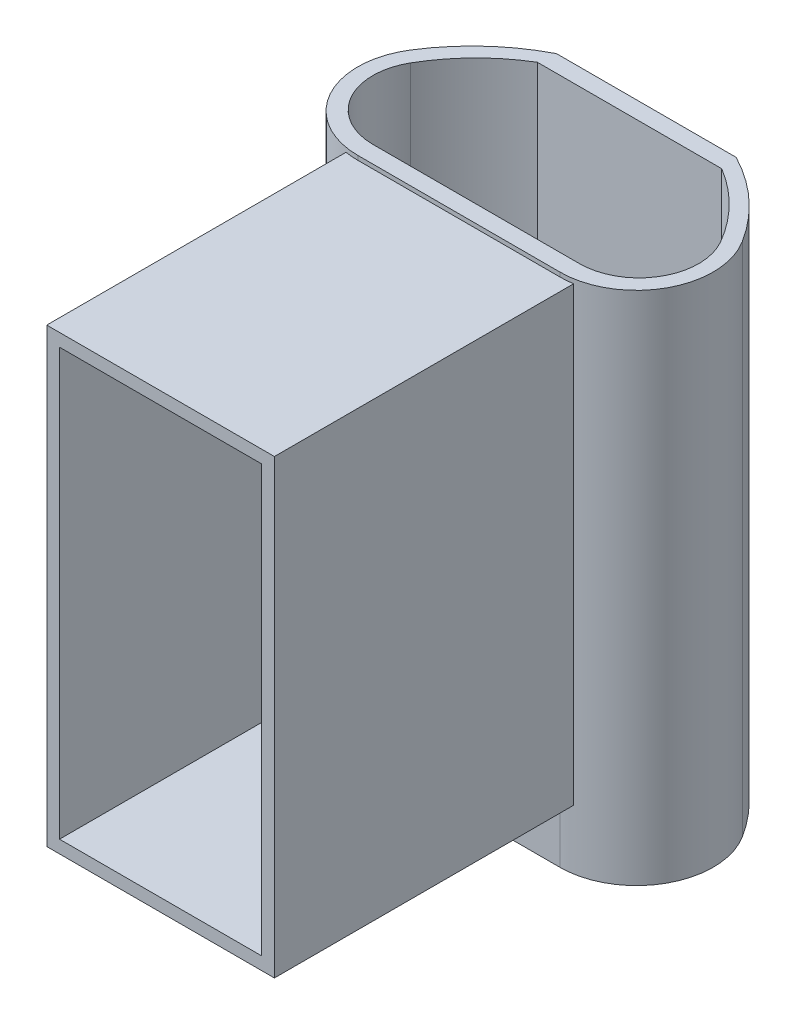
ISO-10303-21;
HEADER;
FILE_DESCRIPTION(('STEP AP214'),'2;1');
FILE_NAME('part.step','',(''),(''),'','','');
FILE_SCHEMA(('AUTOMOTIVE_DESIGN { 1 0 10303 214 1 1 1 1 }'));
ENDSEC;
DATA;
#1=APPLICATION_CONTEXT('core data for automotive mechanical design processes');
#2=APPLICATION_PROTOCOL_DEFINITION('international standard','automotive_design',2000,#1);
#3=PRODUCT_CONTEXT('',#1,'mechanical');
#4=PRODUCT('Part','Part','',(#3));
#5=PRODUCT_RELATED_PRODUCT_CATEGORY('part','',(#4));
#6=PRODUCT_DEFINITION_FORMATION('','',#4);
#7=PRODUCT_DEFINITION_CONTEXT('part definition',#1,'design');
#8=PRODUCT_DEFINITION('design','',#6,#7);
#9=PRODUCT_DEFINITION_SHAPE('','',#8);
#10=(LENGTH_UNIT() NAMED_UNIT(*) SI_UNIT(.MILLI.,.METRE.));
#11=(NAMED_UNIT(*) PLANE_ANGLE_UNIT() SI_UNIT($,.RADIAN.));
#12=(NAMED_UNIT(*) SI_UNIT($,.STERADIAN.) SOLID_ANGLE_UNIT());
#13=UNCERTAINTY_MEASURE_WITH_UNIT(LENGTH_MEASURE(1.E-05),#10,'distance_accuracy_value','');
#14=(GEOMETRIC_REPRESENTATION_CONTEXT(3) GLOBAL_UNCERTAINTY_ASSIGNED_CONTEXT((#13)) GLOBAL_UNIT_ASSIGNED_CONTEXT((#10,
#11,#12)) REPRESENTATION_CONTEXT('',''));
#15=CARTESIAN_POINT('',(0.,0.,0.));
#16=DIRECTION('',(0.,0.,1.));
#17=DIRECTION('',(1.,0.,0.));
#18=AXIS2_PLACEMENT_3D('',#15,#16,#17);
#19=CARTESIAN_POINT('',(0.,15.5,0.));
#20=DIRECTION('',(0.,1.,0.));
#21=DIRECTION('',(0.,0.,1.));
#22=AXIS2_PLACEMENT_3D('',#19,#20,#21);
#23=PLANE('',#22);
#24=CARTESIAN_POINT('',(-12.1243556529821,15.5,-7.));
#25=DIRECTION('',(0.,1.,0.));
#26=DIRECTION('',(0.,0.,1.));
#27=AXIS2_PLACEMENT_3D('',#24,#25,#26);
#28=CIRCLE('',#27,7.);
#29=CARTESIAN_POINT('',(-12.1243556529821,15.5,0.));
#30=VERTEX_POINT('',#29);
#31=CARTESIAN_POINT('',(-18.1865334794732,15.5,-10.5));
#32=VERTEX_POINT('',#31);
#33=EDGE_CURVE('E357',#30,#32,#28,.F.);
#34=ORIENTED_EDGE('',*,*,#33,.F.);
#35=DIRECTION('',(-1.,0.,0.));
#36=VECTOR('',#35,1.);
#37=CARTESIAN_POINT('',(0.,15.5,0.));
#38=LINE('',#37,#36);
#39=CARTESIAN_POINT('',(12.1243556529821,15.5,0.));
#40=VERTEX_POINT('',#39);
#41=EDGE_CURVE('E366',#40,#30,#38,.T.);
#42=ORIENTED_EDGE('',*,*,#41,.F.);
#43=CARTESIAN_POINT('',(12.1243556529821,15.5,-7.));
#44=DIRECTION('',(0.,1.,0.));
#45=DIRECTION('',(0.,0.,1.));
#46=AXIS2_PLACEMENT_3D('',#43,#44,#45);
#47=CIRCLE('',#46,7.);
#48=CARTESIAN_POINT('',(18.1865334794732,15.5,-10.5));
#49=VERTEX_POINT('',#48);
#50=EDGE_CURVE('E356',#49,#40,#47,.F.);
#51=ORIENTED_EDGE('',*,*,#50,.F.);
#52=CARTESIAN_POINT('',(0.,15.5,0.));
#53=DIRECTION('',(0.,1.,0.));
#54=DIRECTION('',(0.,0.,1.));
#55=AXIS2_PLACEMENT_3D('',#52,#53,#54);
#56=CIRCLE('',#55,21.);
#57=CARTESIAN_POINT('',(10.816653826392,15.5,-18.));
#58=VERTEX_POINT('',#57);
#59=EDGE_CURVE('E360',#58,#49,#56,.F.);
#60=ORIENTED_EDGE('',*,*,#59,.F.);
#61=DIRECTION('',(-1.,0.,0.));
#62=VECTOR('',#61,1.);
#63=CARTESIAN_POINT('',(0.,15.5,-18.));
#64=LINE('',#63,#62);
#65=CARTESIAN_POINT('',(-10.816653826392,15.5,-18.));
#66=VERTEX_POINT('',#65);
#67=EDGE_CURVE('E241',#58,#66,#64,.T.);
#68=ORIENTED_EDGE('',*,*,#67,.T.);
#69=CARTESIAN_POINT('',(0.,15.5,0.));
#70=DIRECTION('',(0.,1.,0.));
#71=DIRECTION('',(0.,0.,1.));
#72=AXIS2_PLACEMENT_3D('',#69,#70,#71);
#73=CIRCLE('',#72,21.);
#74=EDGE_CURVE('E363',#32,#66,#73,.F.);
#75=ORIENTED_EDGE('',*,*,#74,.F.);
#76=EDGE_LOOP('',(#34,#42,#51,#60,#68,#75));
#77=FACE_BOUND('',#76,.T.);
#78=CARTESIAN_POINT('',(11.8231616387094,15.5,-6.99999999999999));
#79=DIRECTION('',(0.,1.,0.));
#80=DIRECTION('',(0.,0.,1.));
#81=AXIS2_PLACEMENT_3D('',#78,#79,#80);
#82=CIRCLE('',#81,9.);
#83=CARTESIAN_POINT('',(19.445856551026,15.5,-11.784822073363));
#84=VERTEX_POINT('',#83);
#85=CARTESIAN_POINT('',(11.8231616387094,15.5,2.));
#86=VERTEX_POINT('',#85);
#87=EDGE_CURVE('E244',#84,#86,#82,.F.);
#88=ORIENTED_EDGE('',*,*,#87,.T.);
#89=DIRECTION('',(-1.,0.,0.));
#90=VECTOR('',#89,1.);
#91=CARTESIAN_POINT('',(22.9128784747792,15.5,2.));
#92=LINE('',#91,#90);
#93=CARTESIAN_POINT('',(-11.8918891996092,15.5,2.00000000000001));
#94=VERTEX_POINT('',#93);
#95=EDGE_CURVE('E232',#86,#94,#92,.T.);
#96=ORIENTED_EDGE('',*,*,#95,.T.);
#97=CARTESIAN_POINT('',(-11.8918891996092,15.5,-6.99999999999999));
#98=DIRECTION('',(0.,1.,0.));
#99=DIRECTION('',(0.,0.,1.));
#100=AXIS2_PLACEMENT_3D('',#97,#98,#99);
#101=CIRCLE('',#100,9.);
#102=CARTESIAN_POINT('',(-19.5145841119258,15.5,-11.784822073363));
#103=VERTEX_POINT('',#102);
#104=EDGE_CURVE('E59',#94,#103,#101,.F.);
#105=ORIENTED_EDGE('',*,*,#104,.T.);
#106=CARTESIAN_POINT('',(-0.0343637804498904,15.5,0.443056558564638));
#107=DIRECTION('',(0.,1.,0.));
#108=DIRECTION('',(0.,0.,1.));
#109=AXIS2_PLACEMENT_3D('',#106,#107,#108);
#110=CIRCLE('',#109,23.);
#111=CARTESIAN_POINT('',(-10.5738817268897,15.5,-20.));
#112=VERTEX_POINT('',#111);
#113=EDGE_CURVE('E225',#103,#112,#110,.F.);
#114=ORIENTED_EDGE('',*,*,#113,.T.);
#115=DIRECTION('',(1.,0.,0.));
#116=VECTOR('',#115,1.);
#117=CARTESIAN_POINT('',(0.,15.5,-20.));
#118=LINE('',#117,#116);
#119=CARTESIAN_POINT('',(10.50515416599,15.5,-20.));
#120=VERTEX_POINT('',#119);
#121=EDGE_CURVE('E210',#112,#120,#118,.T.);
#122=ORIENTED_EDGE('',*,*,#121,.T.);
#123=CARTESIAN_POINT('',(-0.0343637804498904,15.5,0.443056558564638));
#124=DIRECTION('',(0.,1.,0.));
#125=DIRECTION('',(0.,0.,1.));
#126=AXIS2_PLACEMENT_3D('',#123,#124,#125);
#127=CIRCLE('',#126,23.);
#128=EDGE_CURVE('E222',#120,#84,#127,.F.);
#129=ORIENTED_EDGE('',*,*,#128,.T.);
#130=EDGE_LOOP('',(#88,#96,#105,#114,#122,#129));
#131=FACE_BOUND('',#130,.T.);
#132=ADVANCED_FACE('F55',(#77,#131),#23,.F.);
#133=CARTESIAN_POINT('',(0.,76.,0.));
#134=DIRECTION('',(0.,-1.,0.));
#135=DIRECTION('',(0.,0.,-1.));
#136=AXIS2_PLACEMENT_3D('',#133,#134,#135);
#137=PLANE('',#136);
#138=DIRECTION('',(1.,0.,0.));
#139=VECTOR('',#138,1.);
#140=CARTESIAN_POINT('',(0.,76.,-18.));
#141=LINE('',#140,#139);
#142=CARTESIAN_POINT('',(-10.816653826392,76.,-18.));
#143=VERTEX_POINT('',#142);
#144=CARTESIAN_POINT('',(10.816653826392,76.,-18.));
#145=VERTEX_POINT('',#144);
#146=EDGE_CURVE('E236',#143,#145,#141,.T.);
#147=ORIENTED_EDGE('',*,*,#146,.T.);
#148=CARTESIAN_POINT('',(0.,76.,0.));
#149=DIRECTION('',(0.,-1.,0.));
#150=DIRECTION('',(0.,0.,-1.));
#151=AXIS2_PLACEMENT_3D('',#148,#149,#150);
#152=CIRCLE('',#151,21.);
#153=CARTESIAN_POINT('',(18.1865334794732,76.,-10.5));
#154=VERTEX_POINT('',#153);
#155=EDGE_CURVE('E361',#154,#145,#152,.F.);
#156=ORIENTED_EDGE('',*,*,#155,.F.);
#157=CARTESIAN_POINT('',(12.1243556529821,76.,-7.));
#158=DIRECTION('',(0.,-1.,0.));
#159=DIRECTION('',(0.,0.,-1.));
#160=AXIS2_PLACEMENT_3D('',#157,#158,#159);
#161=CIRCLE('',#160,7.);
#162=CARTESIAN_POINT('',(12.1243556529821,76.,0.));
#163=VERTEX_POINT('',#162);
#164=EDGE_CURVE('E354',#163,#154,#161,.F.);
#165=ORIENTED_EDGE('',*,*,#164,.F.);
#166=DIRECTION('',(1.,0.,0.));
#167=VECTOR('',#166,1.);
#168=CARTESIAN_POINT('',(0.,76.,0.));
#169=LINE('',#168,#167);
#170=CARTESIAN_POINT('',(-12.1243556529821,76.,0.));
#171=VERTEX_POINT('',#170);
#172=EDGE_CURVE('E367',#171,#163,#169,.T.);
#173=ORIENTED_EDGE('',*,*,#172,.F.);
#174=CARTESIAN_POINT('',(-12.1243556529821,76.,-7.));
#175=DIRECTION('',(0.,-1.,0.));
#176=DIRECTION('',(0.,0.,-1.));
#177=AXIS2_PLACEMENT_3D('',#174,#175,#176);
#178=CIRCLE('',#177,7.);
#179=CARTESIAN_POINT('',(-18.1865334794732,76.,-10.5));
#180=VERTEX_POINT('',#179);
#181=EDGE_CURVE('E358',#180,#171,#178,.F.);
#182=ORIENTED_EDGE('',*,*,#181,.F.);
#183=CARTESIAN_POINT('',(0.,76.,0.));
#184=DIRECTION('',(0.,-1.,0.));
#185=DIRECTION('',(0.,0.,-1.));
#186=AXIS2_PLACEMENT_3D('',#183,#184,#185);
#187=CIRCLE('',#186,21.);
#188=EDGE_CURVE('E364',#143,#180,#187,.F.);
#189=ORIENTED_EDGE('',*,*,#188,.F.);
#190=EDGE_LOOP('',(#147,#156,#165,#173,#182,#189));
#191=FACE_BOUND('',#190,.T.);
#192=CARTESIAN_POINT('',(-0.0343637804498904,76.,0.443056558564638));
#193=DIRECTION('',(0.,-1.,0.));
#194=DIRECTION('',(0.,0.,-1.));
#195=AXIS2_PLACEMENT_3D('',#192,#193,#194);
#196=CIRCLE('',#195,23.);
#197=CARTESIAN_POINT('',(19.445856551026,76.,-11.784822073363));
#198=VERTEX_POINT('',#197);
#199=CARTESIAN_POINT('',(10.50515416599,76.,-20.));
#200=VERTEX_POINT('',#199);
#201=EDGE_CURVE('E231',#198,#200,#196,.F.);
#202=ORIENTED_EDGE('',*,*,#201,.T.);
#203=DIRECTION('',(-1.,0.,0.));
#204=VECTOR('',#203,1.);
#205=CARTESIAN_POINT('',(-10.5738817268897,76.,-20.));
#206=LINE('',#205,#204);
#207=CARTESIAN_POINT('',(-10.5738817268897,76.,-20.));
#208=VERTEX_POINT('',#207);
#209=EDGE_CURVE('E212',#200,#208,#206,.T.);
#210=ORIENTED_EDGE('',*,*,#209,.T.);
#211=CARTESIAN_POINT('',(-0.0343637804498904,76.,0.443056558564638));
#212=DIRECTION('',(0.,-1.,0.));
#213=DIRECTION('',(0.,0.,-1.));
#214=AXIS2_PLACEMENT_3D('',#211,#212,#213);
#215=CIRCLE('',#214,23.);
#216=CARTESIAN_POINT('',(-19.5145841119258,76.,-11.784822073363));
#217=VERTEX_POINT('',#216);
#218=EDGE_CURVE('E372',#208,#217,#215,.F.);
#219=ORIENTED_EDGE('',*,*,#218,.T.);
#220=CARTESIAN_POINT('',(-11.8918891996092,76.,-6.99999999999999));
#221=DIRECTION('',(0.,-1.,0.));
#222=DIRECTION('',(0.,0.,-1.));
#223=AXIS2_PLACEMENT_3D('',#220,#221,#222);
#224=CIRCLE('',#223,9.);
#225=CARTESIAN_POINT('',(-11.8918891996092,76.,2.00000000000001));
#226=VERTEX_POINT('',#225);
#227=EDGE_CURVE('E245',#217,#226,#224,.F.);
#228=ORIENTED_EDGE('',*,*,#227,.T.);
#229=DIRECTION('',(1.,0.,0.));
#230=VECTOR('',#229,1.);
#231=CARTESIAN_POINT('',(22.9128784747792,76.,2.));
#232=LINE('',#231,#230);
#233=CARTESIAN_POINT('',(11.8231616387094,76.,2.));
#234=VERTEX_POINT('',#233);
#235=EDGE_CURVE('E369',#226,#234,#232,.T.);
#236=ORIENTED_EDGE('',*,*,#235,.T.);
#237=CARTESIAN_POINT('',(11.8231616387094,76.,-6.99999999999999));
#238=DIRECTION('',(0.,-1.,0.));
#239=DIRECTION('',(0.,0.,-1.));
#240=AXIS2_PLACEMENT_3D('',#237,#238,#239);
#241=CIRCLE('',#240,9.);
#242=EDGE_CURVE('E243',#234,#198,#241,.F.);
#243=ORIENTED_EDGE('',*,*,#242,.T.);
#244=EDGE_LOOP('',(#202,#210,#219,#228,#236,#243));
#245=FACE_BOUND('',#244,.T.);
#246=ADVANCED_FACE('F57',(#191,#245),#137,.F.);
#247=CARTESIAN_POINT('',(0.,0.,37.));
#248=DIRECTION('',(0.,0.,-1.));
#249=DIRECTION('',(-1.,0.,0.));
#250=AXIS2_PLACEMENT_3D('',#247,#248,#249);
#251=PLANE('',#250);
#252=DIRECTION('',(-1.,0.,0.));
#253=VECTOR('',#252,1.);
#254=CARTESIAN_POINT('',(-13.3918891996092,75.5,37.));
#255=LINE('',#254,#253);
#256=CARTESIAN_POINT('',(13.3231616387094,75.5,37.));
#257=VERTEX_POINT('',#256);
#258=CARTESIAN_POINT('',(-13.3918891996092,75.5,37.));
#259=VERTEX_POINT('',#258);
#260=EDGE_CURVE('E345',#257,#259,#255,.T.);
#261=ORIENTED_EDGE('',*,*,#260,.T.);
#262=DIRECTION('',(0.,-1.,0.));
#263=VECTOR('',#262,1.);
#264=CARTESIAN_POINT('',(-13.3918891996092,75.5,37.));
#265=LINE('',#264,#263);
#266=CARTESIAN_POINT('',(-13.3918891996092,22.5,37.));
#267=VERTEX_POINT('',#266);
#268=EDGE_CURVE('E342',#259,#267,#265,.T.);
#269=ORIENTED_EDGE('',*,*,#268,.T.);
#270=DIRECTION('',(1.,0.,0.));
#271=VECTOR('',#270,1.);
#272=CARTESIAN_POINT('',(-13.3918891996092,22.5,37.));
#273=LINE('',#272,#271);
#274=CARTESIAN_POINT('',(13.3231616387094,22.5,37.));
#275=VERTEX_POINT('',#274);
#276=EDGE_CURVE('E339',#267,#275,#273,.T.);
#277=ORIENTED_EDGE('',*,*,#276,.T.);
#278=DIRECTION('',(0.,1.,0.));
#279=VECTOR('',#278,1.);
#280=CARTESIAN_POINT('',(13.3231616387094,75.5,37.));
#281=LINE('',#280,#279);
#282=EDGE_CURVE('E331',#275,#257,#281,.T.);
#283=ORIENTED_EDGE('',*,*,#282,.T.);
#284=EDGE_LOOP('',(#261,#269,#277,#283));
#285=FACE_BOUND('',#284,.T.);
#286=DIRECTION('',(0.,-1.,0.));
#287=VECTOR('',#286,1.);
#288=CARTESIAN_POINT('',(-11.8918891996092,74.,37.));
#289=LINE('',#288,#287);
#290=CARTESIAN_POINT('',(-11.8918891996092,74.,37.));
#291=VERTEX_POINT('',#290);
#292=CARTESIAN_POINT('',(-11.8918891996092,24.,37.));
#293=VERTEX_POINT('',#292);
#294=EDGE_CURVE('E13',#291,#293,#289,.T.);
#295=ORIENTED_EDGE('',*,*,#294,.F.);
#296=DIRECTION('',(-1.,0.,0.));
#297=VECTOR('',#296,1.);
#298=CARTESIAN_POINT('',(-11.8918891996092,74.,37.));
#299=LINE('',#298,#297);
#300=CARTESIAN_POINT('',(11.8231616387094,74.,37.));
#301=VERTEX_POINT('',#300);
#302=EDGE_CURVE('E348',#301,#291,#299,.T.);
#303=ORIENTED_EDGE('',*,*,#302,.F.);
#304=DIRECTION('',(0.,1.,0.));
#305=VECTOR('',#304,1.);
#306=CARTESIAN_POINT('',(11.8231616387094,74.,37.));
#307=LINE('',#306,#305);
#308=CARTESIAN_POINT('',(11.8231616387094,24.,37.));
#309=VERTEX_POINT('',#308);
#310=EDGE_CURVE('E351',#309,#301,#307,.T.);
#311=ORIENTED_EDGE('',*,*,#310,.F.);
#312=DIRECTION('',(1.,0.,0.));
#313=VECTOR('',#312,1.);
#314=CARTESIAN_POINT('',(-11.8918891996092,24.,37.));
#315=LINE('',#314,#313);
#316=EDGE_CURVE('E64',#293,#309,#315,.T.);
#317=ORIENTED_EDGE('',*,*,#316,.F.);
#318=EDGE_LOOP('',(#295,#303,#311,#317));
#319=FACE_BOUND('',#318,.T.);
#320=ADVANCED_FACE('F423',(#285,#319),#251,.F.);
#321=CARTESIAN_POINT('',(-10.5738817268897,14.,-20.));
#322=DIRECTION('',(0.,0.,-1.));
#323=DIRECTION('',(-1.,0.,0.));
#324=AXIS2_PLACEMENT_3D('',#321,#322,#323);
#325=PLANE('',#324);
#326=ORIENTED_EDGE('',*,*,#209,.F.);
#327=DIRECTION('',(0.,1.,0.));
#328=VECTOR('',#327,1.);
#329=CARTESIAN_POINT('',(10.50515416599,14.,-20.));
#330=LINE('',#329,#328);
#331=EDGE_CURVE('E206',#120,#200,#330,.T.);
#332=ORIENTED_EDGE('',*,*,#331,.F.);
#333=ORIENTED_EDGE('',*,*,#121,.F.);
#334=DIRECTION('',(0.,1.,0.));
#335=VECTOR('',#334,1.);
#336=CARTESIAN_POINT('',(-10.5738817268897,14.,-20.));
#337=LINE('',#336,#335);
#338=EDGE_CURVE('E218',#112,#208,#337,.T.);
#339=ORIENTED_EDGE('',*,*,#338,.T.);
#340=EDGE_LOOP('',(#326,#332,#333,#339));
#341=FACE_BOUND('',#340,.T.);
#342=ADVANCED_FACE('F208',(#341),#325,.T.);
#343=CARTESIAN_POINT('',(13.3231616387094,75.5,1.00000000000001));
#344=DIRECTION('',(1.,0.,0.));
#345=DIRECTION('',(0.,0.,-1.));
#346=AXIS2_PLACEMENT_3D('',#343,#344,#345);
#347=PLANE('',#346);
#348=DIRECTION('',(0.,0.,1.));
#349=VECTOR('',#348,1.);
#350=CARTESIAN_POINT('',(13.3231616387094,22.5,1.00000000000001));
#351=LINE('',#350,#349);
#352=CARTESIAN_POINT('',(13.3231616387094,22.5,1.87411967464943));
#353=VERTEX_POINT('',#352);
#354=EDGE_CURVE('E334',#353,#275,#351,.T.);
#355=ORIENTED_EDGE('',*,*,#354,.F.);
#356=DIRECTION('',(0.,1.,0.));
#357=VECTOR('',#356,1.);
#358=CARTESIAN_POINT('',(13.3231616387094,14.,1.87411967464943));
#359=LINE('',#358,#357);
#360=CARTESIAN_POINT('',(13.3231616387094,75.5,1.87411967464943));
#361=VERTEX_POINT('',#360);
#362=EDGE_CURVE('E410',#353,#361,#359,.T.);
#363=ORIENTED_EDGE('',*,*,#362,.T.);
#364=DIRECTION('',(0.,0.,1.));
#365=VECTOR('',#364,1.);
#366=CARTESIAN_POINT('',(13.3231616387094,75.5,1.00000000000001));
#367=LINE('',#366,#365);
#368=EDGE_CURVE('E328',#361,#257,#367,.T.);
#369=ORIENTED_EDGE('',*,*,#368,.T.);
#370=ORIENTED_EDGE('',*,*,#282,.F.);
#371=EDGE_LOOP('',(#355,#363,#369,#370));
#372=FACE_BOUND('',#371,.T.);
#373=ADVANCED_FACE('F428',(#372),#347,.T.);
#374=CARTESIAN_POINT('',(22.9128784747792,14.,2.));
#375=DIRECTION('',(0.,0.,1.));
#376=DIRECTION('',(1.,0.,0.));
#377=AXIS2_PLACEMENT_3D('',#374,#375,#376);
#378=PLANE('',#377);
#379=ORIENTED_EDGE('',*,*,#235,.F.);
#380=DIRECTION('',(0.,1.,0.));
#381=VECTOR('',#380,1.);
#382=CARTESIAN_POINT('',(-11.8918891996092,14.,2.00000000000001));
#383=LINE('',#382,#381);
#384=CARTESIAN_POINT('',(-11.8918891996092,75.5,2.00000000000001));
#385=VERTEX_POINT('',#384);
#386=EDGE_CURVE('E278',#226,#385,#383,.F.);
#387=ORIENTED_EDGE('',*,*,#386,.T.);
#388=DIRECTION('',(-1.,0.,0.));
#389=VECTOR('',#388,1.);
#390=CARTESIAN_POINT('',(22.9128784747792,75.5,2.));
#391=LINE('',#390,#389);
#392=CARTESIAN_POINT('',(11.8231616387094,75.5,2.));
#393=VERTEX_POINT('',#392);
#394=EDGE_CURVE('E319',#393,#385,#391,.T.);
#395=ORIENTED_EDGE('',*,*,#394,.F.);
#396=DIRECTION('',(0.,1.,0.));
#397=VECTOR('',#396,1.);
#398=CARTESIAN_POINT('',(11.8231616387094,14.,2.));
#399=LINE('',#398,#397);
#400=EDGE_CURVE('E279',#393,#234,#399,.T.);
#401=ORIENTED_EDGE('',*,*,#400,.T.);
#402=EDGE_LOOP('',(#379,#387,#395,#401));
#403=FACE_BOUND('',#402,.T.);
#404=ADVANCED_FACE('F441',(#403),#378,.T.);
#405=CARTESIAN_POINT('',(-13.3918891996092,75.5,1.00000000000001));
#406=DIRECTION('',(0.,1.,0.));
#407=DIRECTION('',(0.,0.,1.));
#408=AXIS2_PLACEMENT_3D('',#405,#406,#407);
#409=PLANE('',#408);
#410=ORIENTED_EDGE('',*,*,#368,.F.);
#411=CARTESIAN_POINT('',(11.8231616387094,75.5,-6.99999999999999));
#412=DIRECTION('',(0.,1.,0.));
#413=DIRECTION('',(0.,0.,1.));
#414=AXIS2_PLACEMENT_3D('',#411,#412,#413);
#415=CIRCLE('',#414,9.);
#416=EDGE_CURVE('E312',#361,#393,#415,.F.);
#417=ORIENTED_EDGE('',*,*,#416,.T.);
#418=ORIENTED_EDGE('',*,*,#394,.T.);
#419=CARTESIAN_POINT('',(-11.8918891996092,75.5,-6.99999999999999));
#420=DIRECTION('',(0.,1.,0.));
#421=DIRECTION('',(0.,0.,1.));
#422=AXIS2_PLACEMENT_3D('',#419,#420,#421);
#423=CIRCLE('',#422,9.);
#424=CARTESIAN_POINT('',(-13.3918891996092,75.5,1.87411967464943));
#425=VERTEX_POINT('',#424);
#426=EDGE_CURVE('E295',#385,#425,#423,.F.);
#427=ORIENTED_EDGE('',*,*,#426,.T.);
#428=DIRECTION('',(0.,0.,1.));
#429=VECTOR('',#428,1.);
#430=CARTESIAN_POINT('',(-13.3918891996092,75.5,1.00000000000001));
#431=LINE('',#430,#429);
#432=EDGE_CURVE('E329',#425,#259,#431,.T.);
#433=ORIENTED_EDGE('',*,*,#432,.T.);
#434=ORIENTED_EDGE('',*,*,#260,.F.);
#435=EDGE_LOOP('',(#410,#417,#418,#427,#433,#434));
#436=FACE_BOUND('',#435,.T.);
#437=ADVANCED_FACE('F416',(#436),#409,.T.);
#438=CARTESIAN_POINT('',(-13.3918891996092,75.5,1.00000000000001));
#439=DIRECTION('',(-1.,0.,0.));
#440=DIRECTION('',(0.,0.,1.));
#441=AXIS2_PLACEMENT_3D('',#438,#439,#440);
#442=PLANE('',#441);
#443=ORIENTED_EDGE('',*,*,#432,.F.);
#444=DIRECTION('',(0.,1.,0.));
#445=VECTOR('',#444,1.);
#446=CARTESIAN_POINT('',(-13.3918891996092,14.,1.87411967464943));
#447=LINE('',#446,#445);
#448=CARTESIAN_POINT('',(-13.3918891996092,22.5,1.87411967464943));
#449=VERTEX_POINT('',#448);
#450=EDGE_CURVE('E285',#425,#449,#447,.F.);
#451=ORIENTED_EDGE('',*,*,#450,.T.);
#452=DIRECTION('',(0.,0.,1.));
#453=VECTOR('',#452,1.);
#454=CARTESIAN_POINT('',(-13.3918891996092,22.5,1.00000000000001));
#455=LINE('',#454,#453);
#456=EDGE_CURVE('E332',#449,#267,#455,.T.);
#457=ORIENTED_EDGE('',*,*,#456,.T.);
#458=ORIENTED_EDGE('',*,*,#268,.F.);
#459=EDGE_LOOP('',(#443,#451,#457,#458));
#460=FACE_BOUND('',#459,.T.);
#461=ADVANCED_FACE('F420',(#460),#442,.T.);
#462=CARTESIAN_POINT('',(-13.3918891996092,22.5,1.00000000000001));
#463=DIRECTION('',(0.,-1.,0.));
#464=DIRECTION('',(0.,0.,-1.));
#465=AXIS2_PLACEMENT_3D('',#462,#463,#464);
#466=PLANE('',#465);
#467=DIRECTION('',(1.,0.,0.));
#468=VECTOR('',#467,1.);
#469=CARTESIAN_POINT('',(22.9128784747792,22.5,2.));
#470=LINE('',#469,#468);
#471=CARTESIAN_POINT('',(-11.8918891996092,22.5,2.00000000000001));
#472=VERTEX_POINT('',#471);
#473=CARTESIAN_POINT('',(11.8231616387094,22.5,2.));
#474=VERTEX_POINT('',#473);
#475=EDGE_CURVE('E325',#472,#474,#470,.T.);
#476=ORIENTED_EDGE('',*,*,#475,.T.);
#477=CARTESIAN_POINT('',(11.8231616387094,22.5,-6.99999999999999));
#478=DIRECTION('',(0.,-1.,0.));
#479=DIRECTION('',(0.,0.,-1.));
#480=AXIS2_PLACEMENT_3D('',#477,#478,#479);
#481=CIRCLE('',#480,9.);
#482=EDGE_CURVE('E322',#474,#353,#481,.F.);
#483=ORIENTED_EDGE('',*,*,#482,.T.);
#484=ORIENTED_EDGE('',*,*,#354,.T.);
#485=ORIENTED_EDGE('',*,*,#276,.F.);
#486=ORIENTED_EDGE('',*,*,#456,.F.);
#487=CARTESIAN_POINT('',(-11.8918891996092,22.5,-6.99999999999999));
#488=DIRECTION('',(0.,-1.,0.));
#489=DIRECTION('',(0.,0.,-1.));
#490=AXIS2_PLACEMENT_3D('',#487,#488,#489);
#491=CIRCLE('',#490,9.);
#492=EDGE_CURVE('E289',#449,#472,#491,.F.);
#493=ORIENTED_EDGE('',*,*,#492,.T.);
#494=EDGE_LOOP('',(#476,#483,#484,#485,#486,#493));
#495=FACE_BOUND('',#494,.T.);
#496=ADVANCED_FACE('F435',(#495),#466,.T.);
#497=ORIENTED_EDGE('',*,*,#95,.F.);
#498=EDGE_CURVE('E282',#86,#474,#399,.T.);
#499=ORIENTED_EDGE('',*,*,#498,.T.);
#500=ORIENTED_EDGE('',*,*,#475,.F.);
#501=EDGE_CURVE('E275',#472,#94,#383,.F.);
#502=ORIENTED_EDGE('',*,*,#501,.T.);
#503=EDGE_LOOP('',(#497,#499,#500,#502));
#504=FACE_BOUND('',#503,.T.);
#505=ADVANCED_FACE('F438',(#504),#378,.T.);
#506=CARTESIAN_POINT('',(-0.0343637804498904,14.,0.443056558564638));
#507=DIRECTION('',(0.,1.,0.));
#508=DIRECTION('',(0.,0.,1.));
#509=AXIS2_PLACEMENT_3D('',#506,#507,#508);
#510=CYLINDRICAL_SURFACE('',#509,23.);
#511=DIRECTION('',(0.,1.,0.));
#512=VECTOR('',#511,1.);
#513=CARTESIAN_POINT('',(19.445856551026,14.,-11.784822073363));
#514=LINE('',#513,#512);
#515=EDGE_CURVE('E230',#198,#84,#514,.F.);
#516=ORIENTED_EDGE('',*,*,#515,.T.);
#517=ORIENTED_EDGE('',*,*,#128,.F.);
#518=ORIENTED_EDGE('',*,*,#331,.T.);
#519=ORIENTED_EDGE('',*,*,#201,.F.);
#520=EDGE_LOOP('',(#516,#517,#518,#519));
#521=FACE_BOUND('',#520,.T.);
#522=ADVANCED_FACE('F228',(#521),#510,.T.);
#523=CARTESIAN_POINT('',(-0.0343637804498904,14.,0.443056558564638));
#524=DIRECTION('',(0.,1.,0.));
#525=DIRECTION('',(0.,0.,1.));
#526=AXIS2_PLACEMENT_3D('',#523,#524,#525);
#527=CYLINDRICAL_SURFACE('',#526,23.);
#528=ORIENTED_EDGE('',*,*,#338,.F.);
#529=ORIENTED_EDGE('',*,*,#113,.F.);
#530=DIRECTION('',(0.,1.,0.));
#531=VECTOR('',#530,1.);
#532=CARTESIAN_POINT('',(-19.5145841119258,14.,-11.784822073363));
#533=LINE('',#532,#531);
#534=EDGE_CURVE('E283',#103,#217,#533,.T.);
#535=ORIENTED_EDGE('',*,*,#534,.T.);
#536=ORIENTED_EDGE('',*,*,#218,.F.);
#537=EDGE_LOOP('',(#528,#529,#535,#536));
#538=FACE_BOUND('',#537,.T.);
#539=ADVANCED_FACE('F442',(#538),#527,.T.);
#540=CARTESIAN_POINT('',(-11.8918891996092,14.,-6.99999999999999));
#541=DIRECTION('',(0.,1.,0.));
#542=DIRECTION('',(0.,0.,1.));
#543=AXIS2_PLACEMENT_3D('',#540,#541,#542);
#544=CYLINDRICAL_SURFACE('',#543,9.);
#545=ORIENTED_EDGE('',*,*,#534,.F.);
#546=ORIENTED_EDGE('',*,*,#104,.F.);
#547=ORIENTED_EDGE('',*,*,#501,.F.);
#548=ORIENTED_EDGE('',*,*,#492,.F.);
#549=ORIENTED_EDGE('',*,*,#450,.F.);
#550=ORIENTED_EDGE('',*,*,#426,.F.);
#551=ORIENTED_EDGE('',*,*,#386,.F.);
#552=ORIENTED_EDGE('',*,*,#227,.F.);
#553=EDGE_LOOP('',(#545,#546,#547,#548,#549,#550,#551,#552));
#554=FACE_BOUND('',#553,.T.);
#555=ADVANCED_FACE('F439',(#554),#544,.T.);
#556=CARTESIAN_POINT('',(11.8231616387094,14.,-6.99999999999999));
#557=DIRECTION('',(0.,1.,0.));
#558=DIRECTION('',(0.,0.,1.));
#559=AXIS2_PLACEMENT_3D('',#556,#557,#558);
#560=CYLINDRICAL_SURFACE('',#559,9.);
#561=ORIENTED_EDGE('',*,*,#498,.F.);
#562=ORIENTED_EDGE('',*,*,#87,.F.);
#563=ORIENTED_EDGE('',*,*,#515,.F.);
#564=ORIENTED_EDGE('',*,*,#242,.F.);
#565=ORIENTED_EDGE('',*,*,#400,.F.);
#566=ORIENTED_EDGE('',*,*,#416,.F.);
#567=ORIENTED_EDGE('',*,*,#362,.F.);
#568=ORIENTED_EDGE('',*,*,#482,.F.);
#569=EDGE_LOOP('',(#561,#562,#563,#564,#565,#566,#567,#568));
#570=FACE_BOUND('',#569,.T.);
#571=ADVANCED_FACE('F432',(#570),#560,.T.);
#572=CARTESIAN_POINT('',(11.8231616387094,74.,-5.99999999999999));
#573=DIRECTION('',(1.,0.,0.));
#574=DIRECTION('',(0.,1.,0.));
#575=AXIS2_PLACEMENT_3D('',#572,#573,#574);
#576=PLANE('',#575);
#577=DIRECTION('',(0.,0.,1.));
#578=VECTOR('',#577,1.);
#579=CARTESIAN_POINT('',(11.8231616387094,24.,-5.99999999999999));
#580=LINE('',#579,#578);
#581=CARTESIAN_POINT('',(11.8231616387094,24.,0.));
#582=VERTEX_POINT('',#581);
#583=EDGE_CURVE('E79',#582,#309,#580,.T.);
#584=ORIENTED_EDGE('',*,*,#583,.T.);
#585=ORIENTED_EDGE('',*,*,#310,.T.);
#586=DIRECTION('',(0.,0.,1.));
#587=VECTOR('',#586,1.);
#588=CARTESIAN_POINT('',(11.8231616387094,74.,-5.99999999999999));
#589=LINE('',#588,#587);
#590=CARTESIAN_POINT('',(11.8231616387094,74.,0.));
#591=VERTEX_POINT('',#590);
#592=EDGE_CURVE('E314',#591,#301,#589,.T.);
#593=ORIENTED_EDGE('',*,*,#592,.F.);
#594=DIRECTION('',(0.,1.,0.));
#595=VECTOR('',#594,1.);
#596=CARTESIAN_POINT('',(11.8231616387094,81.5,0.));
#597=LINE('',#596,#595);
#598=EDGE_CURVE('E217',#582,#591,#597,.T.);
#599=ORIENTED_EDGE('',*,*,#598,.F.);
#600=EDGE_LOOP('',(#584,#585,#593,#599));
#601=FACE_BOUND('',#600,.T.);
#602=ADVANCED_FACE('F459',(#601),#576,.F.);
#603=CARTESIAN_POINT('',(-11.8918891996092,24.,-5.99999999999999));
#604=DIRECTION('',(0.,-1.,0.));
#605=DIRECTION('',(0.,0.,-1.));
#606=AXIS2_PLACEMENT_3D('',#603,#604,#605);
#607=PLANE('',#606);
#608=DIRECTION('',(0.,0.,1.));
#609=VECTOR('',#608,1.);
#610=CARTESIAN_POINT('',(-11.8918891996092,24.,-5.99999999999999));
#611=LINE('',#610,#609);
#612=CARTESIAN_POINT('',(-11.8918891996092,24.,0.));
#613=VERTEX_POINT('',#612);
#614=EDGE_CURVE('E72',#613,#293,#611,.T.);
#615=ORIENTED_EDGE('',*,*,#614,.T.);
#616=ORIENTED_EDGE('',*,*,#316,.T.);
#617=ORIENTED_EDGE('',*,*,#583,.F.);
#618=DIRECTION('',(1.,0.,0.));
#619=VECTOR('',#618,1.);
#620=CARTESIAN_POINT('',(0.,24.,0.));
#621=LINE('',#620,#619);
#622=EDGE_CURVE('E307',#613,#582,#621,.T.);
#623=ORIENTED_EDGE('',*,*,#622,.F.);
#624=EDGE_LOOP('',(#615,#616,#617,#623));
#625=FACE_BOUND('',#624,.T.);
#626=ADVANCED_FACE('F463',(#625),#607,.F.);
#627=CARTESIAN_POINT('',(-11.8918891996092,74.,-5.99999999999999));
#628=DIRECTION('',(-1.,0.,0.));
#629=DIRECTION('',(0.,0.,1.));
#630=AXIS2_PLACEMENT_3D('',#627,#628,#629);
#631=PLANE('',#630);
#632=DIRECTION('',(0.,0.,1.));
#633=VECTOR('',#632,1.);
#634=CARTESIAN_POINT('',(-11.8918891996092,74.,-5.99999999999999));
#635=LINE('',#634,#633);
#636=CARTESIAN_POINT('',(-11.8918891996092,74.,0.));
#637=VERTEX_POINT('',#636);
#638=EDGE_CURVE('E310',#637,#291,#635,.T.);
#639=ORIENTED_EDGE('',*,*,#638,.T.);
#640=ORIENTED_EDGE('',*,*,#294,.T.);
#641=ORIENTED_EDGE('',*,*,#614,.F.);
#642=DIRECTION('',(0.,-1.,0.));
#643=VECTOR('',#642,1.);
#644=CARTESIAN_POINT('',(-11.8918891996092,81.5,0.));
#645=LINE('',#644,#643);
#646=EDGE_CURVE('E301',#637,#613,#645,.T.);
#647=ORIENTED_EDGE('',*,*,#646,.F.);
#648=EDGE_LOOP('',(#639,#640,#641,#647));
#649=FACE_BOUND('',#648,.T.);
#650=ADVANCED_FACE('F469',(#649),#631,.F.);
#651=CARTESIAN_POINT('',(-11.8918891996092,74.,-5.99999999999999));
#652=DIRECTION('',(0.,1.,0.));
#653=DIRECTION('',(0.,0.,1.));
#654=AXIS2_PLACEMENT_3D('',#651,#652,#653);
#655=PLANE('',#654);
#656=ORIENTED_EDGE('',*,*,#592,.T.);
#657=ORIENTED_EDGE('',*,*,#302,.T.);
#658=ORIENTED_EDGE('',*,*,#638,.F.);
#659=DIRECTION('',(-1.,0.,0.));
#660=VECTOR('',#659,1.);
#661=CARTESIAN_POINT('',(0.,74.,0.));
#662=LINE('',#661,#660);
#663=EDGE_CURVE('E304',#591,#637,#662,.T.);
#664=ORIENTED_EDGE('',*,*,#663,.F.);
#665=EDGE_LOOP('',(#656,#657,#658,#664));
#666=FACE_BOUND('',#665,.T.);
#667=ADVANCED_FACE('F473',(#666),#655,.F.);
#668=CARTESIAN_POINT('',(0.,81.5,-18.));
#669=DIRECTION('',(0.,0.,1.));
#670=DIRECTION('',(1.,0.,0.));
#671=AXIS2_PLACEMENT_3D('',#668,#669,#670);
#672=PLANE('',#671);
#673=ORIENTED_EDGE('',*,*,#146,.F.);
#674=DIRECTION('',(0.,-1.,0.));
#675=VECTOR('',#674,1.);
#676=CARTESIAN_POINT('',(-10.816653826392,81.5,-18.));
#677=LINE('',#676,#675);
#678=EDGE_CURVE('E260',#143,#66,#677,.T.);
#679=ORIENTED_EDGE('',*,*,#678,.T.);
#680=ORIENTED_EDGE('',*,*,#67,.F.);
#681=DIRECTION('',(0.,-1.,0.));
#682=VECTOR('',#681,1.);
#683=CARTESIAN_POINT('',(10.816653826392,81.5,-18.));
#684=LINE('',#683,#682);
#685=EDGE_CURVE('E257',#145,#58,#684,.T.);
#686=ORIENTED_EDGE('',*,*,#685,.F.);
#687=EDGE_LOOP('',(#673,#679,#680,#686));
#688=FACE_BOUND('',#687,.T.);
#689=ADVANCED_FACE('F382',(#688),#672,.T.);
#690=CARTESIAN_POINT('',(0.,81.5,0.));
#691=DIRECTION('',(0.,-1.,0.));
#692=DIRECTION('',(0.,0.,-1.));
#693=AXIS2_PLACEMENT_3D('',#690,#691,#692);
#694=CYLINDRICAL_SURFACE('',#693,21.);
#695=DIRECTION('',(0.,-1.,0.));
#696=VECTOR('',#695,1.);
#697=CARTESIAN_POINT('',(18.1865334794732,81.5,-10.5));
#698=LINE('',#697,#696);
#699=EDGE_CURVE('E272',#49,#154,#698,.F.);
#700=ORIENTED_EDGE('',*,*,#699,.T.);
#701=ORIENTED_EDGE('',*,*,#155,.T.);
#702=ORIENTED_EDGE('',*,*,#685,.T.);
#703=ORIENTED_EDGE('',*,*,#59,.T.);
#704=EDGE_LOOP('',(#700,#701,#702,#703));
#705=FACE_BOUND('',#704,.T.);
#706=ADVANCED_FACE('F385',(#705),#694,.F.);
#707=CARTESIAN_POINT('',(0.,81.5,0.));
#708=DIRECTION('',(0.,0.,1.));
#709=DIRECTION('',(1.,0.,0.));
#710=AXIS2_PLACEMENT_3D('',#707,#708,#709);
#711=PLANE('',#710);
#712=ORIENTED_EDGE('',*,*,#663,.T.);
#713=ORIENTED_EDGE('',*,*,#646,.T.);
#714=ORIENTED_EDGE('',*,*,#622,.T.);
#715=ORIENTED_EDGE('',*,*,#598,.T.);
#716=EDGE_LOOP('',(#712,#713,#714,#715));
#717=FACE_BOUND('',#716,.T.);
#718=DIRECTION('',(0.,1.,0.));
#719=VECTOR('',#718,1.);
#720=CARTESIAN_POINT('',(-12.1243556529821,81.5,0.));
#721=LINE('',#720,#719);
#722=EDGE_CURVE('E269',#30,#171,#721,.T.);
#723=ORIENTED_EDGE('',*,*,#722,.T.);
#724=ORIENTED_EDGE('',*,*,#172,.T.);
#725=DIRECTION('',(0.,1.,0.));
#726=VECTOR('',#725,1.);
#727=CARTESIAN_POINT('',(12.1243556529821,11.5,0.));
#728=LINE('',#727,#726);
#729=EDGE_CURVE('E266',#163,#40,#728,.F.);
#730=ORIENTED_EDGE('',*,*,#729,.T.);
#731=ORIENTED_EDGE('',*,*,#41,.T.);
#732=EDGE_LOOP('',(#723,#724,#730,#731));
#733=FACE_BOUND('',#732,.T.);
#734=ADVANCED_FACE('F396',(#717,#733),#711,.F.);
#735=CARTESIAN_POINT('',(12.1243556529821,81.5,-7.));
#736=DIRECTION('',(0.,-1.,0.));
#737=DIRECTION('',(0.,0.,-1.));
#738=AXIS2_PLACEMENT_3D('',#735,#736,#737);
#739=CYLINDRICAL_SURFACE('',#738,7.);
#740=ORIENTED_EDGE('',*,*,#729,.F.);
#741=ORIENTED_EDGE('',*,*,#164,.T.);
#742=ORIENTED_EDGE('',*,*,#699,.F.);
#743=ORIENTED_EDGE('',*,*,#50,.T.);
#744=EDGE_LOOP('',(#740,#741,#742,#743));
#745=FACE_BOUND('',#744,.T.);
#746=ADVANCED_FACE('F390',(#745),#739,.F.);
#747=ORIENTED_EDGE('',*,*,#678,.F.);
#748=ORIENTED_EDGE('',*,*,#188,.T.);
#749=DIRECTION('',(0.,-1.,0.));
#750=VECTOR('',#749,1.);
#751=CARTESIAN_POINT('',(-18.1865334794732,81.5,-10.5));
#752=LINE('',#751,#750);
#753=EDGE_CURVE('E263',#180,#32,#752,.T.);
#754=ORIENTED_EDGE('',*,*,#753,.T.);
#755=ORIENTED_EDGE('',*,*,#74,.T.);
#756=EDGE_LOOP('',(#747,#748,#754,#755));
#757=FACE_BOUND('',#756,.T.);
#758=ADVANCED_FACE('F402',(#757),#694,.F.);
#759=CARTESIAN_POINT('',(-12.1243556529821,81.5,-7.));
#760=DIRECTION('',(0.,-1.,0.));
#761=DIRECTION('',(0.,0.,-1.));
#762=AXIS2_PLACEMENT_3D('',#759,#760,#761);
#763=CYLINDRICAL_SURFACE('',#762,7.);
#764=ORIENTED_EDGE('',*,*,#753,.F.);
#765=ORIENTED_EDGE('',*,*,#181,.T.);
#766=ORIENTED_EDGE('',*,*,#722,.F.);
#767=ORIENTED_EDGE('',*,*,#33,.T.);
#768=EDGE_LOOP('',(#764,#765,#766,#767));
#769=FACE_BOUND('',#768,.T.);
#770=ADVANCED_FACE('F400',(#769),#763,.F.);
#771=CLOSED_SHELL('',(#132,#246,#320,#342,#373,#404,#437,#461,#496,#505,#522,#539,#555,#571,
#602,#626,#650,#667,#689,#706,#734,#746,#758,#770));
#772=MANIFOLD_SOLID_BREP('B2',#771);
#773=ADVANCED_BREP_SHAPE_REPRESENTATION('',(#18,#772),#14);
#774=SHAPE_DEFINITION_REPRESENTATION(#9,#773);
ENDSEC;
END-ISO-10303-21;
